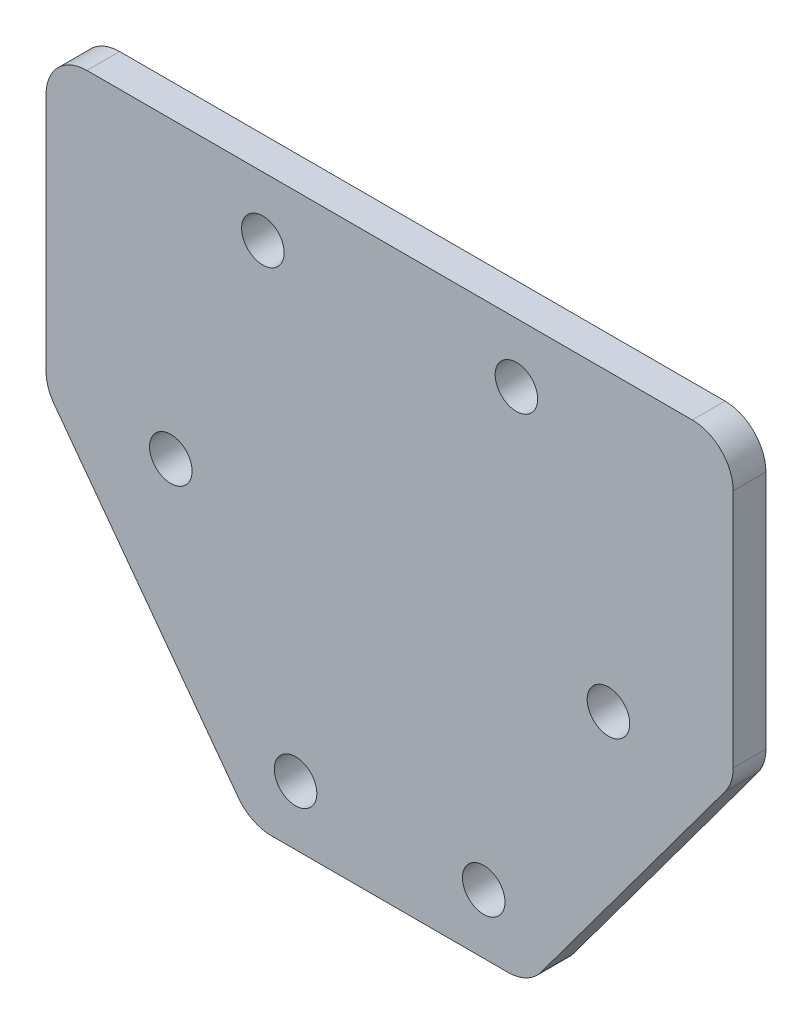
ISO-10303-21;
HEADER;
FILE_DESCRIPTION(('STEP AP214'),'2;1');
FILE_NAME('part.step','',(''),(''),'','','');
FILE_SCHEMA(('AUTOMOTIVE_DESIGN { 1 0 10303 214 1 1 1 1 }'));
ENDSEC;
DATA;
#1=APPLICATION_CONTEXT('core data for automotive mechanical design processes');
#2=APPLICATION_PROTOCOL_DEFINITION('international standard','automotive_design',2000,#1);
#3=PRODUCT_CONTEXT('',#1,'mechanical');
#4=PRODUCT('Part','Part','',(#3));
#5=PRODUCT_RELATED_PRODUCT_CATEGORY('part','',(#4));
#6=PRODUCT_DEFINITION_FORMATION('','',#4);
#7=PRODUCT_DEFINITION_CONTEXT('part definition',#1,'design');
#8=PRODUCT_DEFINITION('design','',#6,#7);
#9=PRODUCT_DEFINITION_SHAPE('','',#8);
#10=(LENGTH_UNIT() NAMED_UNIT(*) SI_UNIT(.MILLI.,.METRE.));
#11=(NAMED_UNIT(*) PLANE_ANGLE_UNIT() SI_UNIT($,.RADIAN.));
#12=(NAMED_UNIT(*) SI_UNIT($,.STERADIAN.) SOLID_ANGLE_UNIT());
#13=UNCERTAINTY_MEASURE_WITH_UNIT(LENGTH_MEASURE(1.E-05),#10,'distance_accuracy_value','');
#14=(GEOMETRIC_REPRESENTATION_CONTEXT(3) GLOBAL_UNCERTAINTY_ASSIGNED_CONTEXT((#13)) GLOBAL_UNIT_ASSIGNED_CONTEXT((#10,
#11,#12)) REPRESENTATION_CONTEXT('',''));
#15=CARTESIAN_POINT('',(0.,0.,0.));
#16=DIRECTION('',(0.,0.,1.));
#17=DIRECTION('',(1.,0.,0.));
#18=AXIS2_PLACEMENT_3D('',#15,#16,#17);
#19=CARTESIAN_POINT('',(0.,0.,4.));
#20=DIRECTION('',(0.,0.,-1.));
#21=DIRECTION('',(-1.,0.,0.));
#22=AXIS2_PLACEMENT_3D('',#19,#20,#21);
#23=PLANE('',#22);
#24=DIRECTION('',(1.,0.,0.));
#25=VECTOR('',#24,1.);
#26=CARTESIAN_POINT('',(-17.,-51.7490740613724,4.));
#27=LINE('',#26,#25);
#28=CARTESIAN_POINT('',(-14.4814123834797,-51.7490740613724,4.));
#29=VERTEX_POINT('',#28);
#30=CARTESIAN_POINT('',(14.4814123834797,-51.7490740613724,4.));
#31=VERTEX_POINT('',#30);
#32=EDGE_CURVE('E163',#29,#31,#27,.T.);
#33=ORIENTED_EDGE('',*,*,#32,.T.);
#34=CARTESIAN_POINT('',(14.4814123834797,-46.7490740613724,4.));
#35=DIRECTION('',(0.,0.,-1.));
#36=DIRECTION('',(-1.,0.,0.));
#37=AXIS2_PLACEMENT_3D('',#34,#35,#36);
#38=CIRCLE('',#37,5.);
#39=CARTESIAN_POINT('',(18.4991592955478,-49.7252645375629,4.));
#40=VERTEX_POINT('',#39);
#41=EDGE_CURVE('E195',#31,#40,#38,.F.);
#42=ORIENTED_EDGE('',*,*,#41,.T.);
#43=DIRECTION('',(0.595238095238095,0.803549382413629,0.));
#44=VECTOR('',#43,1.);
#45=CARTESIAN_POINT('',(17.,-51.7490740613724,4.));
#46=LINE('',#45,#44);
#47=CARTESIAN_POINT('',(41.0177469120681,-19.326005288465,4.));
#48=VERTEX_POINT('',#47);
#49=EDGE_CURVE('E145',#40,#48,#46,.T.);
#50=ORIENTED_EDGE('',*,*,#49,.T.);
#51=CARTESIAN_POINT('',(37.,-16.3498148122745,4.));
#52=DIRECTION('',(0.,0.,-1.));
#53=DIRECTION('',(-1.,0.,0.));
#54=AXIS2_PLACEMENT_3D('',#51,#52,#53);
#55=CIRCLE('',#54,5.);
#56=CARTESIAN_POINT('',(42.,-16.3498148122745,4.));
#57=VERTEX_POINT('',#56);
#58=EDGE_CURVE('E188',#48,#57,#55,.F.);
#59=ORIENTED_EDGE('',*,*,#58,.T.);
#60=DIRECTION('',(0.,1.,0.));
#61=VECTOR('',#60,1.);
#62=CARTESIAN_POINT('',(42.,18.,4.));
#63=LINE('',#62,#61);
#64=CARTESIAN_POINT('',(42.,13.,4.));
#65=VERTEX_POINT('',#64);
#66=EDGE_CURVE('E217',#57,#65,#63,.T.);
#67=ORIENTED_EDGE('',*,*,#66,.T.);
#68=CARTESIAN_POINT('',(37.,13.,4.));
#69=DIRECTION('',(0.,0.,-1.));
#70=DIRECTION('',(-1.,0.,0.));
#71=AXIS2_PLACEMENT_3D('',#68,#69,#70);
#72=CIRCLE('',#71,5.);
#73=CARTESIAN_POINT('',(37.,18.,4.));
#74=VERTEX_POINT('',#73);
#75=EDGE_CURVE('E190',#65,#74,#72,.F.);
#76=ORIENTED_EDGE('',*,*,#75,.T.);
#77=DIRECTION('',(-1.,0.,0.));
#78=VECTOR('',#77,1.);
#79=CARTESIAN_POINT('',(-42.,18.,4.));
#80=LINE('',#79,#78);
#81=CARTESIAN_POINT('',(-37.,18.,4.));
#82=VERTEX_POINT('',#81);
#83=EDGE_CURVE('E230',#74,#82,#80,.T.);
#84=ORIENTED_EDGE('',*,*,#83,.T.);
#85=CARTESIAN_POINT('',(-37.,13.,4.));
#86=DIRECTION('',(0.,0.,-1.));
#87=DIRECTION('',(-1.,0.,0.));
#88=AXIS2_PLACEMENT_3D('',#85,#86,#87);
#89=CIRCLE('',#88,5.);
#90=CARTESIAN_POINT('',(-42.,13.,4.));
#91=VERTEX_POINT('',#90);
#92=EDGE_CURVE('E192',#82,#91,#89,.F.);
#93=ORIENTED_EDGE('',*,*,#92,.T.);
#94=DIRECTION('',(0.,-1.,0.));
#95=VECTOR('',#94,1.);
#96=CARTESIAN_POINT('',(-42.,18.,4.));
#97=LINE('',#96,#95);
#98=CARTESIAN_POINT('',(-42.,-16.3498148122745,4.));
#99=VERTEX_POINT('',#98);
#100=EDGE_CURVE('E232',#91,#99,#97,.T.);
#101=ORIENTED_EDGE('',*,*,#100,.T.);
#102=CARTESIAN_POINT('',(-37.,-16.3498148122745,4.));
#103=DIRECTION('',(0.,0.,-1.));
#104=DIRECTION('',(-1.,0.,0.));
#105=AXIS2_PLACEMENT_3D('',#102,#103,#104);
#106=CIRCLE('',#105,5.);
#107=CARTESIAN_POINT('',(-41.0177469120681,-19.326005288465,4.));
#108=VERTEX_POINT('',#107);
#109=EDGE_CURVE('E57',#99,#108,#106,.F.);
#110=ORIENTED_EDGE('',*,*,#109,.T.);
#111=DIRECTION('',(0.595238095238095,-0.803549382413629,0.));
#112=VECTOR('',#111,1.);
#113=CARTESIAN_POINT('',(-42.,-18.,4.));
#114=LINE('',#113,#112);
#115=CARTESIAN_POINT('',(-18.4991592955478,-49.7252645375629,4.));
#116=VERTEX_POINT('',#115);
#117=EDGE_CURVE('E234',#108,#116,#114,.T.);
#118=ORIENTED_EDGE('',*,*,#117,.T.);
#119=CARTESIAN_POINT('',(-14.4814123834797,-46.7490740613724,4.));
#120=DIRECTION('',(0.,0.,-1.));
#121=DIRECTION('',(-1.,0.,0.));
#122=AXIS2_PLACEMENT_3D('',#119,#120,#121);
#123=CIRCLE('',#122,5.);
#124=EDGE_CURVE('E186',#116,#29,#123,.F.);
#125=ORIENTED_EDGE('',*,*,#124,.T.);
#126=EDGE_LOOP('',(#33,#42,#50,#59,#67,#76,#84,#93,#101,#110,#118,#125));
#127=FACE_BOUND('',#126,.T.);
#128=CARTESIAN_POINT('',(-15.5,10.75,4.));
#129=DIRECTION('',(0.,0.,1.));
#130=DIRECTION('',(1.,0.,0.));
#131=AXIS2_PLACEMENT_3D('',#128,#129,#130);
#132=CIRCLE('',#131,2.6);
#133=CARTESIAN_POINT('',(-12.9,10.75,4.));
#134=VERTEX_POINT('',#133);
#135=EDGE_CURVE('E154',#134,#134,#132,.T.);
#136=ORIENTED_EDGE('',*,*,#135,.F.);
#137=EDGE_LOOP('',(#136));
#138=FACE_BOUND('',#137,.T.);
#139=CARTESIAN_POINT('',(15.5,10.75,4.));
#140=DIRECTION('',(0.,0.,1.));
#141=DIRECTION('',(1.,0.,0.));
#142=AXIS2_PLACEMENT_3D('',#139,#140,#141);
#143=CIRCLE('',#142,2.6);
#144=CARTESIAN_POINT('',(18.1,10.75,4.));
#145=VERTEX_POINT('',#144);
#146=EDGE_CURVE('E324',#145,#145,#143,.T.);
#147=ORIENTED_EDGE('',*,*,#146,.F.);
#148=EDGE_LOOP('',(#147));
#149=FACE_BOUND('',#148,.T.);
#150=CARTESIAN_POINT('',(-26.75,-18.,4.));
#151=DIRECTION('',(0.,0.,1.));
#152=DIRECTION('',(1.,0.,0.));
#153=AXIS2_PLACEMENT_3D('',#150,#151,#152);
#154=CIRCLE('',#153,2.6);
#155=CARTESIAN_POINT('',(-24.15,-18.,4.));
#156=VERTEX_POINT('',#155);
#157=EDGE_CURVE('E328',#156,#156,#154,.T.);
#158=ORIENTED_EDGE('',*,*,#157,.F.);
#159=EDGE_LOOP('',(#158));
#160=FACE_BOUND('',#159,.T.);
#161=CARTESIAN_POINT('',(26.75,-18.,4.));
#162=DIRECTION('',(0.,0.,1.));
#163=DIRECTION('',(1.,0.,0.));
#164=AXIS2_PLACEMENT_3D('',#161,#162,#163);
#165=CIRCLE('',#164,2.6);
#166=CARTESIAN_POINT('',(29.35,-18.,4.));
#167=VERTEX_POINT('',#166);
#168=EDGE_CURVE('E453',#167,#167,#165,.T.);
#169=ORIENTED_EDGE('',*,*,#168,.F.);
#170=EDGE_LOOP('',(#169));
#171=FACE_BOUND('',#170,.T.);
#172=CARTESIAN_POINT('',(-11.5,-44.4990740613724,4.));
#173=DIRECTION('',(0.,0.,1.));
#174=DIRECTION('',(1.,0.,0.));
#175=AXIS2_PLACEMENT_3D('',#172,#173,#174);
#176=CIRCLE('',#175,2.6);
#177=CARTESIAN_POINT('',(-8.9,-44.4990740613724,4.));
#178=VERTEX_POINT('',#177);
#179=EDGE_CURVE('E458',#178,#178,#176,.T.);
#180=ORIENTED_EDGE('',*,*,#179,.F.);
#181=EDGE_LOOP('',(#180));
#182=FACE_BOUND('',#181,.T.);
#183=CARTESIAN_POINT('',(11.5,-44.4990740613724,4.));
#184=DIRECTION('',(0.,0.,1.));
#185=DIRECTION('',(1.,0.,0.));
#186=AXIS2_PLACEMENT_3D('',#183,#184,#185);
#187=CIRCLE('',#186,2.6);
#188=CARTESIAN_POINT('',(14.1,-44.4990740613724,4.));
#189=VERTEX_POINT('',#188);
#190=EDGE_CURVE('E464',#189,#189,#187,.T.);
#191=ORIENTED_EDGE('',*,*,#190,.F.);
#192=EDGE_LOOP('',(#191));
#193=FACE_BOUND('',#192,.T.);
#194=ADVANCED_FACE('F35',(#127,#138,#149,#160,#171,#182,#193),#23,.F.);
#195=CARTESIAN_POINT('',(0.,0.,0.));
#196=DIRECTION('',(0.,0.,-1.));
#197=DIRECTION('',(-1.,0.,0.));
#198=AXIS2_PLACEMENT_3D('',#195,#196,#197);
#199=PLANE('',#198);
#200=CARTESIAN_POINT('',(-11.5,-44.4990740613724,0.));
#201=DIRECTION('',(0.,0.,1.));
#202=DIRECTION('',(1.,0.,0.));
#203=AXIS2_PLACEMENT_3D('',#200,#201,#202);
#204=CIRCLE('',#203,2.6);
#205=CARTESIAN_POINT('',(-8.9,-44.4990740613724,0.));
#206=VERTEX_POINT('',#205);
#207=EDGE_CURVE('E461',#206,#206,#204,.T.);
#208=ORIENTED_EDGE('',*,*,#207,.T.);
#209=EDGE_LOOP('',(#208));
#210=FACE_BOUND('',#209,.T.);
#211=CARTESIAN_POINT('',(-26.75,-18.,0.));
#212=DIRECTION('',(0.,0.,1.));
#213=DIRECTION('',(1.,0.,0.));
#214=AXIS2_PLACEMENT_3D('',#211,#212,#213);
#215=CIRCLE('',#214,2.6);
#216=CARTESIAN_POINT('',(-24.15,-18.,0.));
#217=VERTEX_POINT('',#216);
#218=EDGE_CURVE('E332',#217,#217,#215,.T.);
#219=ORIENTED_EDGE('',*,*,#218,.T.);
#220=EDGE_LOOP('',(#219));
#221=FACE_BOUND('',#220,.T.);
#222=CARTESIAN_POINT('',(-15.5,10.75,0.));
#223=DIRECTION('',(0.,0.,1.));
#224=DIRECTION('',(1.,0.,0.));
#225=AXIS2_PLACEMENT_3D('',#222,#223,#224);
#226=CIRCLE('',#225,2.6);
#227=CARTESIAN_POINT('',(-12.9,10.75,0.));
#228=VERTEX_POINT('',#227);
#229=EDGE_CURVE('E160',#228,#228,#226,.T.);
#230=ORIENTED_EDGE('',*,*,#229,.T.);
#231=EDGE_LOOP('',(#230));
#232=FACE_BOUND('',#231,.T.);
#233=DIRECTION('',(0.595238095238095,0.803549382413629,0.));
#234=VECTOR('',#233,1.);
#235=CARTESIAN_POINT('',(17.,-51.7490740613724,0.));
#236=LINE('',#235,#234);
#237=CARTESIAN_POINT('',(18.4991592955478,-49.7252645375629,0.));
#238=VERTEX_POINT('',#237);
#239=CARTESIAN_POINT('',(41.0177469120681,-19.326005288465,0.));
#240=VERTEX_POINT('',#239);
#241=EDGE_CURVE('E142',#238,#240,#236,.T.);
#242=ORIENTED_EDGE('',*,*,#241,.F.);
#243=CARTESIAN_POINT('',(14.4814123834797,-46.7490740613724,0.));
#244=DIRECTION('',(0.,0.,-1.));
#245=DIRECTION('',(-1.,0.,0.));
#246=AXIS2_PLACEMENT_3D('',#243,#244,#245);
#247=CIRCLE('',#246,5.);
#248=CARTESIAN_POINT('',(14.4814123834797,-51.7490740613724,0.));
#249=VERTEX_POINT('',#248);
#250=EDGE_CURVE('E125',#238,#249,#247,.T.);
#251=ORIENTED_EDGE('',*,*,#250,.T.);
#252=DIRECTION('',(1.,0.,0.));
#253=VECTOR('',#252,1.);
#254=CARTESIAN_POINT('',(-17.,-51.7490740613724,0.));
#255=LINE('',#254,#253);
#256=CARTESIAN_POINT('',(-14.4814123834797,-51.7490740613724,0.));
#257=VERTEX_POINT('',#256);
#258=EDGE_CURVE('E173',#257,#249,#255,.T.);
#259=ORIENTED_EDGE('',*,*,#258,.F.);
#260=CARTESIAN_POINT('',(-14.4814123834797,-46.7490740613724,0.));
#261=DIRECTION('',(0.,0.,-1.));
#262=DIRECTION('',(-1.,0.,0.));
#263=AXIS2_PLACEMENT_3D('',#260,#261,#262);
#264=CIRCLE('',#263,5.);
#265=CARTESIAN_POINT('',(-18.4991592955478,-49.7252645375629,0.));
#266=VERTEX_POINT('',#265);
#267=EDGE_CURVE('E146',#257,#266,#264,.T.);
#268=ORIENTED_EDGE('',*,*,#267,.T.);
#269=DIRECTION('',(0.595238095238095,-0.803549382413629,0.));
#270=VECTOR('',#269,1.);
#271=CARTESIAN_POINT('',(-42.,-18.,0.));
#272=LINE('',#271,#270);
#273=CARTESIAN_POINT('',(-41.0177469120681,-19.326005288465,0.));
#274=VERTEX_POINT('',#273);
#275=EDGE_CURVE('E171',#274,#266,#272,.T.);
#276=ORIENTED_EDGE('',*,*,#275,.F.);
#277=CARTESIAN_POINT('',(-37.,-16.3498148122745,0.));
#278=DIRECTION('',(0.,0.,-1.));
#279=DIRECTION('',(-1.,0.,0.));
#280=AXIS2_PLACEMENT_3D('',#277,#278,#279);
#281=CIRCLE('',#280,5.);
#282=CARTESIAN_POINT('',(-42.,-16.3498148122745,0.));
#283=VERTEX_POINT('',#282);
#284=EDGE_CURVE('E136',#274,#283,#281,.T.);
#285=ORIENTED_EDGE('',*,*,#284,.T.);
#286=DIRECTION('',(0.,-1.,0.));
#287=VECTOR('',#286,1.);
#288=CARTESIAN_POINT('',(-42.,18.,0.));
#289=LINE('',#288,#287);
#290=CARTESIAN_POINT('',(-42.,13.,0.));
#291=VERTEX_POINT('',#290);
#292=EDGE_CURVE('E168',#291,#283,#289,.T.);
#293=ORIENTED_EDGE('',*,*,#292,.F.);
#294=CARTESIAN_POINT('',(-37.,13.,0.));
#295=DIRECTION('',(0.,0.,-1.));
#296=DIRECTION('',(-1.,0.,0.));
#297=AXIS2_PLACEMENT_3D('',#294,#295,#296);
#298=CIRCLE('',#297,5.);
#299=CARTESIAN_POINT('',(-37.,18.,0.));
#300=VERTEX_POINT('',#299);
#301=EDGE_CURVE('E180',#291,#300,#298,.T.);
#302=ORIENTED_EDGE('',*,*,#301,.T.);
#303=DIRECTION('',(-1.,0.,0.));
#304=VECTOR('',#303,1.);
#305=CARTESIAN_POINT('',(-42.,18.,0.));
#306=LINE('',#305,#304);
#307=CARTESIAN_POINT('',(37.,18.,0.));
#308=VERTEX_POINT('',#307);
#309=EDGE_CURVE('E157',#308,#300,#306,.T.);
#310=ORIENTED_EDGE('',*,*,#309,.F.);
#311=CARTESIAN_POINT('',(37.,13.,0.));
#312=DIRECTION('',(0.,0.,-1.));
#313=DIRECTION('',(-1.,0.,0.));
#314=AXIS2_PLACEMENT_3D('',#311,#312,#313);
#315=CIRCLE('',#314,5.);
#316=CARTESIAN_POINT('',(42.,13.,0.));
#317=VERTEX_POINT('',#316);
#318=EDGE_CURVE('E178',#308,#317,#315,.T.);
#319=ORIENTED_EDGE('',*,*,#318,.T.);
#320=DIRECTION('',(0.,1.,0.));
#321=VECTOR('',#320,1.);
#322=CARTESIAN_POINT('',(42.,18.,0.));
#323=LINE('',#322,#321);
#324=CARTESIAN_POINT('',(42.,-16.3498148122745,0.));
#325=VERTEX_POINT('',#324);
#326=EDGE_CURVE('E153',#325,#317,#323,.T.);
#327=ORIENTED_EDGE('',*,*,#326,.F.);
#328=CARTESIAN_POINT('',(37.,-16.3498148122745,0.));
#329=DIRECTION('',(0.,0.,-1.));
#330=DIRECTION('',(-1.,0.,0.));
#331=AXIS2_PLACEMENT_3D('',#328,#329,#330);
#332=CIRCLE('',#331,5.);
#333=EDGE_CURVE('E152',#325,#240,#332,.T.);
#334=ORIENTED_EDGE('',*,*,#333,.T.);
#335=EDGE_LOOP('',(#242,#251,#259,#268,#276,#285,#293,#302,#310,#319,#327,#334));
#336=FACE_BOUND('',#335,.T.);
#337=CARTESIAN_POINT('',(15.5,10.75,0.));
#338=DIRECTION('',(0.,0.,1.));
#339=DIRECTION('',(1.,0.,0.));
#340=AXIS2_PLACEMENT_3D('',#337,#338,#339);
#341=CIRCLE('',#340,2.6);
#342=CARTESIAN_POINT('',(18.1,10.75,0.));
#343=VERTEX_POINT('',#342);
#344=EDGE_CURVE('E327',#343,#343,#341,.T.);
#345=ORIENTED_EDGE('',*,*,#344,.T.);
#346=EDGE_LOOP('',(#345));
#347=FACE_BOUND('',#346,.T.);
#348=CARTESIAN_POINT('',(26.75,-18.,0.));
#349=DIRECTION('',(0.,0.,1.));
#350=DIRECTION('',(1.,0.,0.));
#351=AXIS2_PLACEMENT_3D('',#348,#349,#350);
#352=CIRCLE('',#351,2.6);
#353=CARTESIAN_POINT('',(29.35,-18.,0.));
#354=VERTEX_POINT('',#353);
#355=EDGE_CURVE('E455',#354,#354,#352,.T.);
#356=ORIENTED_EDGE('',*,*,#355,.T.);
#357=EDGE_LOOP('',(#356));
#358=FACE_BOUND('',#357,.T.);
#359=CARTESIAN_POINT('',(11.5,-44.4990740613724,0.));
#360=DIRECTION('',(0.,0.,1.));
#361=DIRECTION('',(1.,0.,0.));
#362=AXIS2_PLACEMENT_3D('',#359,#360,#361);
#363=CIRCLE('',#362,2.6);
#364=CARTESIAN_POINT('',(14.1,-44.4990740613724,0.));
#365=VERTEX_POINT('',#364);
#366=EDGE_CURVE('E467',#365,#365,#363,.T.);
#367=ORIENTED_EDGE('',*,*,#366,.T.);
#368=EDGE_LOOP('',(#367));
#369=FACE_BOUND('',#368,.T.);
#370=ADVANCED_FACE('F149',(#210,#221,#232,#336,#347,#358,#369),#199,.T.);
#371=CARTESIAN_POINT('',(17.,-51.7490740613724,4.));
#372=DIRECTION('',(-0.803549382413629,0.595238095238095,0.));
#373=DIRECTION('',(-0.595238095238095,-0.803549382413629,0.));
#374=AXIS2_PLACEMENT_3D('',#371,#372,#373);
#375=PLANE('',#374);
#376=ORIENTED_EDGE('',*,*,#49,.F.);
#377=DIRECTION('',(0.,0.,-1.));
#378=VECTOR('',#377,1.);
#379=CARTESIAN_POINT('',(18.4991592955478,-49.7252645375629,4.));
#380=LINE('',#379,#378);
#381=EDGE_CURVE('E129',#40,#238,#380,.T.);
#382=ORIENTED_EDGE('',*,*,#381,.T.);
#383=ORIENTED_EDGE('',*,*,#241,.T.);
#384=DIRECTION('',(0.,0.,-1.));
#385=VECTOR('',#384,1.);
#386=CARTESIAN_POINT('',(41.0177469120681,-19.326005288465,4.));
#387=LINE('',#386,#385);
#388=EDGE_CURVE('E147',#240,#48,#387,.F.);
#389=ORIENTED_EDGE('',*,*,#388,.T.);
#390=EDGE_LOOP('',(#376,#382,#383,#389));
#391=FACE_BOUND('',#390,.T.);
#392=ADVANCED_FACE('F141',(#391),#375,.F.);
#393=CARTESIAN_POINT('',(42.,18.,4.));
#394=DIRECTION('',(-1.,0.,0.));
#395=DIRECTION('',(0.,0.,1.));
#396=AXIS2_PLACEMENT_3D('',#393,#394,#395);
#397=PLANE('',#396);
#398=ORIENTED_EDGE('',*,*,#326,.T.);
#399=DIRECTION('',(0.,0.,-1.));
#400=VECTOR('',#399,1.);
#401=CARTESIAN_POINT('',(42.,13.,4.));
#402=LINE('',#401,#400);
#403=EDGE_CURVE('E11',#317,#65,#402,.F.);
#404=ORIENTED_EDGE('',*,*,#403,.T.);
#405=ORIENTED_EDGE('',*,*,#66,.F.);
#406=DIRECTION('',(0.,0.,-1.));
#407=VECTOR('',#406,1.);
#408=CARTESIAN_POINT('',(42.,-16.3498148122745,4.));
#409=LINE('',#408,#407);
#410=EDGE_CURVE('E43',#57,#325,#409,.T.);
#411=ORIENTED_EDGE('',*,*,#410,.T.);
#412=EDGE_LOOP('',(#398,#404,#405,#411));
#413=FACE_BOUND('',#412,.T.);
#414=ADVANCED_FACE('F214',(#413),#397,.F.);
#415=CARTESIAN_POINT('',(-42.,18.,4.));
#416=DIRECTION('',(0.,-1.,0.));
#417=DIRECTION('',(0.,0.,-1.));
#418=AXIS2_PLACEMENT_3D('',#415,#416,#417);
#419=PLANE('',#418);
#420=ORIENTED_EDGE('',*,*,#309,.T.);
#421=DIRECTION('',(0.,0.,-1.));
#422=VECTOR('',#421,1.);
#423=CARTESIAN_POINT('',(-37.,18.,4.));
#424=LINE('',#423,#422);
#425=EDGE_CURVE('E209',#300,#82,#424,.F.);
#426=ORIENTED_EDGE('',*,*,#425,.T.);
#427=ORIENTED_EDGE('',*,*,#83,.F.);
#428=DIRECTION('',(0.,0.,-1.));
#429=VECTOR('',#428,1.);
#430=CARTESIAN_POINT('',(37.,18.,4.));
#431=LINE('',#430,#429);
#432=EDGE_CURVE('E206',#74,#308,#431,.T.);
#433=ORIENTED_EDGE('',*,*,#432,.T.);
#434=EDGE_LOOP('',(#420,#426,#427,#433));
#435=FACE_BOUND('',#434,.T.);
#436=ADVANCED_FACE('F227',(#435),#419,.F.);
#437=CARTESIAN_POINT('',(-42.,18.,4.));
#438=DIRECTION('',(1.,0.,0.));
#439=DIRECTION('',(0.,0.,-1.));
#440=AXIS2_PLACEMENT_3D('',#437,#438,#439);
#441=PLANE('',#440);
#442=ORIENTED_EDGE('',*,*,#292,.T.);
#443=DIRECTION('',(0.,0.,-1.));
#444=VECTOR('',#443,1.);
#445=CARTESIAN_POINT('',(-42.,-16.3498148122745,4.));
#446=LINE('',#445,#444);
#447=EDGE_CURVE('E204',#283,#99,#446,.F.);
#448=ORIENTED_EDGE('',*,*,#447,.T.);
#449=ORIENTED_EDGE('',*,*,#100,.F.);
#450=DIRECTION('',(0.,0.,-1.));
#451=VECTOR('',#450,1.);
#452=CARTESIAN_POINT('',(-42.,13.,4.));
#453=LINE('',#452,#451);
#454=EDGE_CURVE('E201',#91,#291,#453,.T.);
#455=ORIENTED_EDGE('',*,*,#454,.T.);
#456=EDGE_LOOP('',(#442,#448,#449,#455));
#457=FACE_BOUND('',#456,.T.);
#458=ADVANCED_FACE('F254',(#457),#441,.F.);
#459=CARTESIAN_POINT('',(-42.,-18.,4.));
#460=DIRECTION('',(0.803549382413629,0.595238095238095,0.));
#461=DIRECTION('',(-0.595238095238095,0.803549382413629,0.));
#462=AXIS2_PLACEMENT_3D('',#459,#460,#461);
#463=PLANE('',#462);
#464=ORIENTED_EDGE('',*,*,#117,.F.);
#465=DIRECTION('',(0.,0.,-1.));
#466=VECTOR('',#465,1.);
#467=CARTESIAN_POINT('',(-41.0177469120681,-19.326005288465,4.));
#468=LINE('',#467,#466);
#469=EDGE_CURVE('E198',#108,#274,#468,.T.);
#470=ORIENTED_EDGE('',*,*,#469,.T.);
#471=ORIENTED_EDGE('',*,*,#275,.T.);
#472=DIRECTION('',(0.,0.,-1.));
#473=VECTOR('',#472,1.);
#474=CARTESIAN_POINT('',(-18.4991592955478,-49.7252645375629,4.));
#475=LINE('',#474,#473);
#476=EDGE_CURVE('E50',#266,#116,#475,.F.);
#477=ORIENTED_EDGE('',*,*,#476,.T.);
#478=EDGE_LOOP('',(#464,#470,#471,#477));
#479=FACE_BOUND('',#478,.T.);
#480=ADVANCED_FACE('F247',(#479),#463,.F.);
#481=CARTESIAN_POINT('',(-17.,-51.7490740613724,4.));
#482=DIRECTION('',(0.,1.,0.));
#483=DIRECTION('',(0.,0.,1.));
#484=AXIS2_PLACEMENT_3D('',#481,#482,#483);
#485=PLANE('',#484);
#486=ORIENTED_EDGE('',*,*,#258,.T.);
#487=DIRECTION('',(0.,0.,-1.));
#488=VECTOR('',#487,1.);
#489=CARTESIAN_POINT('',(14.4814123834797,-51.7490740613724,4.));
#490=LINE('',#489,#488);
#491=EDGE_CURVE('E130',#249,#31,#490,.F.);
#492=ORIENTED_EDGE('',*,*,#491,.T.);
#493=ORIENTED_EDGE('',*,*,#32,.F.);
#494=DIRECTION('',(0.,0.,-1.));
#495=VECTOR('',#494,1.);
#496=CARTESIAN_POINT('',(-14.4814123834797,-51.7490740613724,4.));
#497=LINE('',#496,#495);
#498=EDGE_CURVE('E135',#29,#257,#497,.T.);
#499=ORIENTED_EDGE('',*,*,#498,.T.);
#500=EDGE_LOOP('',(#486,#492,#493,#499));
#501=FACE_BOUND('',#500,.T.);
#502=ADVANCED_FACE('F244',(#501),#485,.F.);
#503=CARTESIAN_POINT('',(-15.5,10.75,4.));
#504=DIRECTION('',(0.,0.,-1.));
#505=DIRECTION('',(-1.,0.,0.));
#506=AXIS2_PLACEMENT_3D('',#503,#504,#505);
#507=CYLINDRICAL_SURFACE('',#506,2.6);
#508=ORIENTED_EDGE('',*,*,#135,.T.);
#509=EDGE_LOOP('',(#508));
#510=FACE_BOUND('',#509,.T.);
#511=ORIENTED_EDGE('',*,*,#229,.F.);
#512=EDGE_LOOP('',(#511));
#513=FACE_BOUND('',#512,.T.);
#514=ADVANCED_FACE('F276',(#510,#513),#507,.F.);
#515=CARTESIAN_POINT('',(15.5,10.75,4.));
#516=DIRECTION('',(0.,0.,-1.));
#517=DIRECTION('',(-1.,0.,0.));
#518=AXIS2_PLACEMENT_3D('',#515,#516,#517);
#519=CYLINDRICAL_SURFACE('',#518,2.6);
#520=ORIENTED_EDGE('',*,*,#146,.T.);
#521=EDGE_LOOP('',(#520));
#522=FACE_BOUND('',#521,.T.);
#523=ORIENTED_EDGE('',*,*,#344,.F.);
#524=EDGE_LOOP('',(#523));
#525=FACE_BOUND('',#524,.T.);
#526=ADVANCED_FACE('F313',(#522,#525),#519,.F.);
#527=CARTESIAN_POINT('',(-26.75,-18.,4.));
#528=DIRECTION('',(0.,0.,-1.));
#529=DIRECTION('',(-1.,0.,0.));
#530=AXIS2_PLACEMENT_3D('',#527,#528,#529);
#531=CYLINDRICAL_SURFACE('',#530,2.6);
#532=ORIENTED_EDGE('',*,*,#157,.T.);
#533=EDGE_LOOP('',(#532));
#534=FACE_BOUND('',#533,.T.);
#535=ORIENTED_EDGE('',*,*,#218,.F.);
#536=EDGE_LOOP('',(#535));
#537=FACE_BOUND('',#536,.T.);
#538=ADVANCED_FACE('F310',(#534,#537),#531,.F.);
#539=CARTESIAN_POINT('',(26.75,-18.,4.));
#540=DIRECTION('',(0.,0.,-1.));
#541=DIRECTION('',(-1.,0.,0.));
#542=AXIS2_PLACEMENT_3D('',#539,#540,#541);
#543=CYLINDRICAL_SURFACE('',#542,2.6);
#544=ORIENTED_EDGE('',*,*,#168,.T.);
#545=EDGE_LOOP('',(#544));
#546=FACE_BOUND('',#545,.T.);
#547=ORIENTED_EDGE('',*,*,#355,.F.);
#548=EDGE_LOOP('',(#547));
#549=FACE_BOUND('',#548,.T.);
#550=ADVANCED_FACE('F302',(#546,#549),#543,.F.);
#551=CARTESIAN_POINT('',(-11.5,-44.4990740613724,4.));
#552=DIRECTION('',(0.,0.,-1.));
#553=DIRECTION('',(-1.,0.,0.));
#554=AXIS2_PLACEMENT_3D('',#551,#552,#553);
#555=CYLINDRICAL_SURFACE('',#554,2.6);
#556=ORIENTED_EDGE('',*,*,#179,.T.);
#557=EDGE_LOOP('',(#556));
#558=FACE_BOUND('',#557,.T.);
#559=ORIENTED_EDGE('',*,*,#207,.F.);
#560=EDGE_LOOP('',(#559));
#561=FACE_BOUND('',#560,.T.);
#562=ADVANCED_FACE('F296',(#558,#561),#555,.F.);
#563=CARTESIAN_POINT('',(11.5,-44.4990740613724,4.));
#564=DIRECTION('',(0.,0.,-1.));
#565=DIRECTION('',(-1.,0.,0.));
#566=AXIS2_PLACEMENT_3D('',#563,#564,#565);
#567=CYLINDRICAL_SURFACE('',#566,2.6);
#568=ORIENTED_EDGE('',*,*,#190,.T.);
#569=EDGE_LOOP('',(#568));
#570=FACE_BOUND('',#569,.T.);
#571=ORIENTED_EDGE('',*,*,#366,.F.);
#572=EDGE_LOOP('',(#571));
#573=FACE_BOUND('',#572,.T.);
#574=ADVANCED_FACE('F292',(#570,#573),#567,.F.);
#575=CARTESIAN_POINT('',(14.4814123834797,-46.7490740613724,4.));
#576=DIRECTION('',(0.,0.,-1.));
#577=DIRECTION('',(-1.,0.,0.));
#578=AXIS2_PLACEMENT_3D('',#575,#576,#577);
#579=CYLINDRICAL_SURFACE('',#578,5.);
#580=ORIENTED_EDGE('',*,*,#41,.F.);
#581=ORIENTED_EDGE('',*,*,#491,.F.);
#582=ORIENTED_EDGE('',*,*,#250,.F.);
#583=ORIENTED_EDGE('',*,*,#381,.F.);
#584=EDGE_LOOP('',(#580,#581,#582,#583));
#585=FACE_BOUND('',#584,.T.);
#586=ADVANCED_FACE('F128',(#585),#579,.T.);
#587=CARTESIAN_POINT('',(-37.,-16.3498148122745,4.));
#588=DIRECTION('',(0.,0.,-1.));
#589=DIRECTION('',(-1.,0.,0.));
#590=AXIS2_PLACEMENT_3D('',#587,#588,#589);
#591=CYLINDRICAL_SURFACE('',#590,5.);
#592=ORIENTED_EDGE('',*,*,#109,.F.);
#593=ORIENTED_EDGE('',*,*,#447,.F.);
#594=ORIENTED_EDGE('',*,*,#284,.F.);
#595=ORIENTED_EDGE('',*,*,#469,.F.);
#596=EDGE_LOOP('',(#592,#593,#594,#595));
#597=FACE_BOUND('',#596,.T.);
#598=ADVANCED_FACE('F250',(#597),#591,.T.);
#599=CARTESIAN_POINT('',(-37.,13.,4.));
#600=DIRECTION('',(0.,0.,-1.));
#601=DIRECTION('',(-1.,0.,0.));
#602=AXIS2_PLACEMENT_3D('',#599,#600,#601);
#603=CYLINDRICAL_SURFACE('',#602,5.);
#604=ORIENTED_EDGE('',*,*,#92,.F.);
#605=ORIENTED_EDGE('',*,*,#425,.F.);
#606=ORIENTED_EDGE('',*,*,#301,.F.);
#607=ORIENTED_EDGE('',*,*,#454,.F.);
#608=EDGE_LOOP('',(#604,#605,#606,#607));
#609=FACE_BOUND('',#608,.T.);
#610=ADVANCED_FACE('F258',(#609),#603,.T.);
#611=CARTESIAN_POINT('',(37.,13.,4.));
#612=DIRECTION('',(0.,0.,-1.));
#613=DIRECTION('',(-1.,0.,0.));
#614=AXIS2_PLACEMENT_3D('',#611,#612,#613);
#615=CYLINDRICAL_SURFACE('',#614,5.);
#616=ORIENTED_EDGE('',*,*,#75,.F.);
#617=ORIENTED_EDGE('',*,*,#403,.F.);
#618=ORIENTED_EDGE('',*,*,#318,.F.);
#619=ORIENTED_EDGE('',*,*,#432,.F.);
#620=EDGE_LOOP('',(#616,#617,#618,#619));
#621=FACE_BOUND('',#620,.T.);
#622=ADVANCED_FACE('F224',(#621),#615,.T.);
#623=CARTESIAN_POINT('',(37.,-16.3498148122745,4.));
#624=DIRECTION('',(0.,0.,-1.));
#625=DIRECTION('',(-1.,0.,0.));
#626=AXIS2_PLACEMENT_3D('',#623,#624,#625);
#627=CYLINDRICAL_SURFACE('',#626,5.);
#628=ORIENTED_EDGE('',*,*,#58,.F.);
#629=ORIENTED_EDGE('',*,*,#388,.F.);
#630=ORIENTED_EDGE('',*,*,#333,.F.);
#631=ORIENTED_EDGE('',*,*,#410,.F.);
#632=EDGE_LOOP('',(#628,#629,#630,#631));
#633=FACE_BOUND('',#632,.T.);
#634=ADVANCED_FACE('F265',(#633),#627,.T.);
#635=CARTESIAN_POINT('',(-14.4814123834797,-46.7490740613724,4.));
#636=DIRECTION('',(0.,0.,-1.));
#637=DIRECTION('',(-1.,0.,0.));
#638=AXIS2_PLACEMENT_3D('',#635,#636,#637);
#639=CYLINDRICAL_SURFACE('',#638,5.);
#640=ORIENTED_EDGE('',*,*,#124,.F.);
#641=ORIENTED_EDGE('',*,*,#476,.F.);
#642=ORIENTED_EDGE('',*,*,#267,.F.);
#643=ORIENTED_EDGE('',*,*,#498,.F.);
#644=EDGE_LOOP('',(#640,#641,#642,#643));
#645=FACE_BOUND('',#644,.T.);
#646=ADVANCED_FACE('F37',(#645),#639,.T.);
#647=CLOSED_SHELL('',(#194,#370,#392,#414,#436,#458,#480,#502,#514,#526,#538,#550,#562,#574,
#586,#598,#610,#622,#634,#646));
#648=MANIFOLD_SOLID_BREP('B2',#647);
#649=ADVANCED_BREP_SHAPE_REPRESENTATION('',(#18,#648),#14);
#650=SHAPE_DEFINITION_REPRESENTATION(#9,#649);
ENDSEC;
END-ISO-10303-21;
